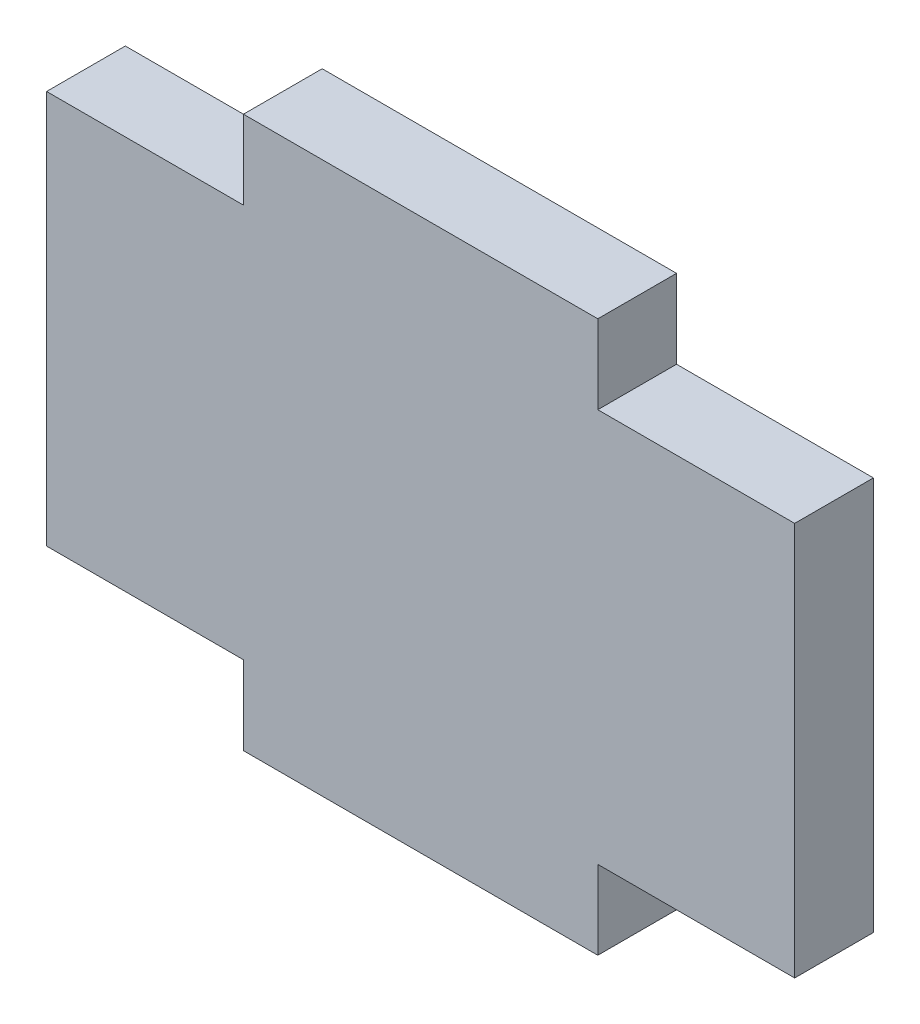
ISO-10303-21;
HEADER;
FILE_DESCRIPTION(('STEP AP214'),'2;1');
FILE_NAME('part.step','',(''),(''),'','','');
FILE_SCHEMA(('AUTOMOTIVE_DESIGN { 1 0 10303 214 1 1 1 1 }'));
ENDSEC;
DATA;
#1=APPLICATION_CONTEXT('core data for automotive mechanical design processes');
#2=APPLICATION_PROTOCOL_DEFINITION('international standard','automotive_design',2000,#1);
#3=PRODUCT_CONTEXT('',#1,'mechanical');
#4=PRODUCT('Part','Part','',(#3));
#5=PRODUCT_RELATED_PRODUCT_CATEGORY('part','',(#4));
#6=PRODUCT_DEFINITION_FORMATION('','',#4);
#7=PRODUCT_DEFINITION_CONTEXT('part definition',#1,'design');
#8=PRODUCT_DEFINITION('design','',#6,#7);
#9=PRODUCT_DEFINITION_SHAPE('','',#8);
#10=(LENGTH_UNIT() NAMED_UNIT(*) SI_UNIT(.MILLI.,.METRE.));
#11=(NAMED_UNIT(*) PLANE_ANGLE_UNIT() SI_UNIT($,.RADIAN.));
#12=(NAMED_UNIT(*) SI_UNIT($,.STERADIAN.) SOLID_ANGLE_UNIT());
#13=UNCERTAINTY_MEASURE_WITH_UNIT(LENGTH_MEASURE(1.E-05),#10,'distance_accuracy_value','');
#14=(GEOMETRIC_REPRESENTATION_CONTEXT(3) GLOBAL_UNCERTAINTY_ASSIGNED_CONTEXT((#13)) GLOBAL_UNIT_ASSIGNED_CONTEXT((#10,
#11,#12)) REPRESENTATION_CONTEXT('',''));
#15=CARTESIAN_POINT('',(0.,0.,0.));
#16=DIRECTION('',(0.,0.,1.));
#17=DIRECTION('',(1.,0.,0.));
#18=AXIS2_PLACEMENT_3D('',#15,#16,#17);
#19=CARTESIAN_POINT('',(19.,20.,4.));
#20=DIRECTION('',(-1.,0.,0.));
#21=DIRECTION('',(0.,-1.,0.));
#22=AXIS2_PLACEMENT_3D('',#19,#20,#21);
#23=PLANE('',#22);
#24=DIRECTION('',(0.,1.,0.));
#25=VECTOR('',#24,1.);
#26=CARTESIAN_POINT('',(19.,20.,0.));
#27=LINE('',#26,#25);
#28=CARTESIAN_POINT('',(19.,0.,0.));
#29=VERTEX_POINT('',#28);
#30=CARTESIAN_POINT('',(19.,20.,0.));
#31=VERTEX_POINT('',#30);
#32=EDGE_CURVE('E153',#29,#31,#27,.T.);
#33=ORIENTED_EDGE('',*,*,#32,.T.);
#34=DIRECTION('',(0.,0.,-1.));
#35=VECTOR('',#34,1.);
#36=CARTESIAN_POINT('',(19.,20.,4.));
#37=LINE('',#36,#35);
#38=CARTESIAN_POINT('',(19.,20.,4.));
#39=VERTEX_POINT('',#38);
#40=EDGE_CURVE('E11',#39,#31,#37,.T.);
#41=ORIENTED_EDGE('',*,*,#40,.F.);
#42=DIRECTION('',(0.,1.,0.));
#43=VECTOR('',#42,1.);
#44=CARTESIAN_POINT('',(19.,20.,4.));
#45=LINE('',#44,#43);
#46=CARTESIAN_POINT('',(19.,0.,4.));
#47=VERTEX_POINT('',#46);
#48=EDGE_CURVE('E175',#47,#39,#45,.T.);
#49=ORIENTED_EDGE('',*,*,#48,.F.);
#50=DIRECTION('',(0.,0.,-1.));
#51=VECTOR('',#50,1.);
#52=CARTESIAN_POINT('',(19.,0.,4.));
#53=LINE('',#52,#51);
#54=EDGE_CURVE('E149',#47,#29,#53,.T.);
#55=ORIENTED_EDGE('',*,*,#54,.T.);
#56=EDGE_LOOP('',(#33,#41,#49,#55));
#57=FACE_BOUND('',#56,.T.);
#58=ADVANCED_FACE('F33',(#57),#23,.F.);
#59=CARTESIAN_POINT('',(9.,20.,4.));
#60=DIRECTION('',(0.,-1.,0.));
#61=DIRECTION('',(0.,0.,-1.));
#62=AXIS2_PLACEMENT_3D('',#59,#60,#61);
#63=PLANE('',#62);
#64=DIRECTION('',(-1.,0.,0.));
#65=VECTOR('',#64,1.);
#66=CARTESIAN_POINT('',(9.,20.,0.));
#67=LINE('',#66,#65);
#68=CARTESIAN_POINT('',(9.,20.,0.));
#69=VERTEX_POINT('',#68);
#70=EDGE_CURVE('E156',#31,#69,#67,.T.);
#71=ORIENTED_EDGE('',*,*,#70,.T.);
#72=DIRECTION('',(0.,0.,-1.));
#73=VECTOR('',#72,1.);
#74=CARTESIAN_POINT('',(9.,20.,4.));
#75=LINE('',#74,#73);
#76=CARTESIAN_POINT('',(9.,20.,4.));
#77=VERTEX_POINT('',#76);
#78=EDGE_CURVE('E41',#77,#69,#75,.T.);
#79=ORIENTED_EDGE('',*,*,#78,.F.);
#80=DIRECTION('',(-1.,0.,0.));
#81=VECTOR('',#80,1.);
#82=CARTESIAN_POINT('',(9.,20.,4.));
#83=LINE('',#82,#81);
#84=EDGE_CURVE('E104',#39,#77,#83,.T.);
#85=ORIENTED_EDGE('',*,*,#84,.F.);
#86=ORIENTED_EDGE('',*,*,#40,.T.);
#87=EDGE_LOOP('',(#71,#79,#85,#86));
#88=FACE_BOUND('',#87,.T.);
#89=ADVANCED_FACE('F253',(#88),#63,.F.);
#90=CARTESIAN_POINT('',(9.,20.,4.));
#91=DIRECTION('',(-1.,0.,0.));
#92=DIRECTION('',(0.,0.,1.));
#93=AXIS2_PLACEMENT_3D('',#90,#91,#92);
#94=PLANE('',#93);
#95=DIRECTION('',(0.,1.,0.));
#96=VECTOR('',#95,1.);
#97=CARTESIAN_POINT('',(9.,20.,0.));
#98=LINE('',#97,#96);
#99=CARTESIAN_POINT('',(9.,24.,0.));
#100=VERTEX_POINT('',#99);
#101=EDGE_CURVE('E158',#69,#100,#98,.T.);
#102=ORIENTED_EDGE('',*,*,#101,.T.);
#103=DIRECTION('',(0.,0.,-1.));
#104=VECTOR('',#103,1.);
#105=CARTESIAN_POINT('',(9.,24.,4.));
#106=LINE('',#105,#104);
#107=CARTESIAN_POINT('',(9.,24.,4.));
#108=VERTEX_POINT('',#107);
#109=EDGE_CURVE('E194',#108,#100,#106,.T.);
#110=ORIENTED_EDGE('',*,*,#109,.F.);
#111=DIRECTION('',(0.,1.,0.));
#112=VECTOR('',#111,1.);
#113=CARTESIAN_POINT('',(9.,20.,4.));
#114=LINE('',#113,#112);
#115=EDGE_CURVE('E202',#77,#108,#114,.T.);
#116=ORIENTED_EDGE('',*,*,#115,.F.);
#117=ORIENTED_EDGE('',*,*,#78,.T.);
#118=EDGE_LOOP('',(#102,#110,#116,#117));
#119=FACE_BOUND('',#118,.T.);
#120=ADVANCED_FACE('F200',(#119),#94,.F.);
#121=CARTESIAN_POINT('',(-9.,24.,4.));
#122=DIRECTION('',(0.,-1.,0.));
#123=DIRECTION('',(0.,0.,-1.));
#124=AXIS2_PLACEMENT_3D('',#121,#122,#123);
#125=PLANE('',#124);
#126=DIRECTION('',(-1.,0.,0.));
#127=VECTOR('',#126,1.);
#128=CARTESIAN_POINT('',(-9.,24.,0.));
#129=LINE('',#128,#127);
#130=CARTESIAN_POINT('',(-9.,24.,0.));
#131=VERTEX_POINT('',#130);
#132=EDGE_CURVE('E160',#100,#131,#129,.T.);
#133=ORIENTED_EDGE('',*,*,#132,.T.);
#134=DIRECTION('',(0.,0.,-1.));
#135=VECTOR('',#134,1.);
#136=CARTESIAN_POINT('',(-9.,24.,4.));
#137=LINE('',#136,#135);
#138=CARTESIAN_POINT('',(-9.,24.,4.));
#139=VERTEX_POINT('',#138);
#140=EDGE_CURVE('E191',#139,#131,#137,.T.);
#141=ORIENTED_EDGE('',*,*,#140,.F.);
#142=DIRECTION('',(-1.,0.,0.));
#143=VECTOR('',#142,1.);
#144=CARTESIAN_POINT('',(-9.,24.,4.));
#145=LINE('',#144,#143);
#146=EDGE_CURVE('E220',#108,#139,#145,.T.);
#147=ORIENTED_EDGE('',*,*,#146,.F.);
#148=ORIENTED_EDGE('',*,*,#109,.T.);
#149=EDGE_LOOP('',(#133,#141,#147,#148));
#150=FACE_BOUND('',#149,.T.);
#151=ADVANCED_FACE('F211',(#150),#125,.F.);
#152=CARTESIAN_POINT('',(-9.,20.,4.));
#153=DIRECTION('',(1.,0.,0.));
#154=DIRECTION('',(0.,0.,-1.));
#155=AXIS2_PLACEMENT_3D('',#152,#153,#154);
#156=PLANE('',#155);
#157=DIRECTION('',(0.,-1.,0.));
#158=VECTOR('',#157,1.);
#159=CARTESIAN_POINT('',(-9.,20.,0.));
#160=LINE('',#159,#158);
#161=CARTESIAN_POINT('',(-9.,20.,0.));
#162=VERTEX_POINT('',#161);
#163=EDGE_CURVE('E162',#131,#162,#160,.T.);
#164=ORIENTED_EDGE('',*,*,#163,.T.);
#165=DIRECTION('',(0.,0.,-1.));
#166=VECTOR('',#165,1.);
#167=CARTESIAN_POINT('',(-9.,20.,4.));
#168=LINE('',#167,#166);
#169=CARTESIAN_POINT('',(-9.,20.,4.));
#170=VERTEX_POINT('',#169);
#171=EDGE_CURVE('E188',#170,#162,#168,.T.);
#172=ORIENTED_EDGE('',*,*,#171,.F.);
#173=DIRECTION('',(0.,-1.,0.));
#174=VECTOR('',#173,1.);
#175=CARTESIAN_POINT('',(-9.,20.,4.));
#176=LINE('',#175,#174);
#177=EDGE_CURVE('E217',#139,#170,#176,.T.);
#178=ORIENTED_EDGE('',*,*,#177,.F.);
#179=ORIENTED_EDGE('',*,*,#140,.T.);
#180=EDGE_LOOP('',(#164,#172,#178,#179));
#181=FACE_BOUND('',#180,.T.);
#182=ADVANCED_FACE('F215',(#181),#156,.F.);
#183=CARTESIAN_POINT('',(-19.,20.,4.));
#184=DIRECTION('',(0.,-1.,0.));
#185=DIRECTION('',(0.,0.,-1.));
#186=AXIS2_PLACEMENT_3D('',#183,#184,#185);
#187=PLANE('',#186);
#188=DIRECTION('',(-1.,0.,0.));
#189=VECTOR('',#188,1.);
#190=CARTESIAN_POINT('',(-19.,20.,0.));
#191=LINE('',#190,#189);
#192=CARTESIAN_POINT('',(-19.,20.,0.));
#193=VERTEX_POINT('',#192);
#194=EDGE_CURVE('E164',#162,#193,#191,.T.);
#195=ORIENTED_EDGE('',*,*,#194,.T.);
#196=DIRECTION('',(0.,0.,-1.));
#197=VECTOR('',#196,1.);
#198=CARTESIAN_POINT('',(-19.,20.,4.));
#199=LINE('',#198,#197);
#200=CARTESIAN_POINT('',(-19.,20.,4.));
#201=VERTEX_POINT('',#200);
#202=EDGE_CURVE('E185',#201,#193,#199,.T.);
#203=ORIENTED_EDGE('',*,*,#202,.F.);
#204=DIRECTION('',(-1.,0.,0.));
#205=VECTOR('',#204,1.);
#206=CARTESIAN_POINT('',(-19.,20.,4.));
#207=LINE('',#206,#205);
#208=EDGE_CURVE('E219',#170,#201,#207,.T.);
#209=ORIENTED_EDGE('',*,*,#208,.F.);
#210=ORIENTED_EDGE('',*,*,#171,.T.);
#211=EDGE_LOOP('',(#195,#203,#209,#210));
#212=FACE_BOUND('',#211,.T.);
#213=ADVANCED_FACE('F266',(#212),#187,.F.);
#214=CARTESIAN_POINT('',(-19.,20.,4.));
#215=DIRECTION('',(1.,0.,0.));
#216=DIRECTION('',(0.,1.,0.));
#217=AXIS2_PLACEMENT_3D('',#214,#215,#216);
#218=PLANE('',#217);
#219=DIRECTION('',(0.,-1.,0.));
#220=VECTOR('',#219,1.);
#221=CARTESIAN_POINT('',(-19.,20.,0.));
#222=LINE('',#221,#220);
#223=CARTESIAN_POINT('',(-19.,0.,0.));
#224=VERTEX_POINT('',#223);
#225=EDGE_CURVE('E166',#193,#224,#222,.T.);
#226=ORIENTED_EDGE('',*,*,#225,.T.);
#227=DIRECTION('',(0.,0.,-1.));
#228=VECTOR('',#227,1.);
#229=CARTESIAN_POINT('',(-19.,0.,4.));
#230=LINE('',#229,#228);
#231=CARTESIAN_POINT('',(-19.,0.,4.));
#232=VERTEX_POINT('',#231);
#233=EDGE_CURVE('E182',#232,#224,#230,.T.);
#234=ORIENTED_EDGE('',*,*,#233,.F.);
#235=DIRECTION('',(0.,-1.,0.));
#236=VECTOR('',#235,1.);
#237=CARTESIAN_POINT('',(-19.,20.,4.));
#238=LINE('',#237,#236);
#239=EDGE_CURVE('E222',#201,#232,#238,.T.);
#240=ORIENTED_EDGE('',*,*,#239,.F.);
#241=ORIENTED_EDGE('',*,*,#202,.T.);
#242=EDGE_LOOP('',(#226,#234,#240,#241));
#243=FACE_BOUND('',#242,.T.);
#244=ADVANCED_FACE('F269',(#243),#218,.F.);
#245=CARTESIAN_POINT('',(-19.,0.,4.));
#246=DIRECTION('',(0.,1.,0.));
#247=DIRECTION('',(-1.,0.,0.));
#248=AXIS2_PLACEMENT_3D('',#245,#246,#247);
#249=PLANE('',#248);
#250=DIRECTION('',(1.,0.,0.));
#251=VECTOR('',#250,1.);
#252=CARTESIAN_POINT('',(-19.,0.,0.));
#253=LINE('',#252,#251);
#254=CARTESIAN_POINT('',(-8.99999999999999,0.,0.));
#255=VERTEX_POINT('',#254);
#256=EDGE_CURVE('E168',#224,#255,#253,.T.);
#257=ORIENTED_EDGE('',*,*,#256,.T.);
#258=DIRECTION('',(0.,0.,-1.));
#259=VECTOR('',#258,1.);
#260=CARTESIAN_POINT('',(-8.99999999999999,0.,4.));
#261=LINE('',#260,#259);
#262=CARTESIAN_POINT('',(-8.99999999999999,0.,4.));
#263=VERTEX_POINT('',#262);
#264=EDGE_CURVE('E179',#263,#255,#261,.T.);
#265=ORIENTED_EDGE('',*,*,#264,.F.);
#266=DIRECTION('',(1.,0.,0.));
#267=VECTOR('',#266,1.);
#268=CARTESIAN_POINT('',(-19.,0.,4.));
#269=LINE('',#268,#267);
#270=EDGE_CURVE('E228',#232,#263,#269,.T.);
#271=ORIENTED_EDGE('',*,*,#270,.F.);
#272=ORIENTED_EDGE('',*,*,#233,.T.);
#273=EDGE_LOOP('',(#257,#265,#271,#272));
#274=FACE_BOUND('',#273,.T.);
#275=ADVANCED_FACE('F234',(#274),#249,.F.);
#276=CARTESIAN_POINT('',(-8.99999999999999,0.,4.));
#277=DIRECTION('',(1.,0.,0.));
#278=DIRECTION('',(0.,0.,-1.));
#279=AXIS2_PLACEMENT_3D('',#276,#277,#278);
#280=PLANE('',#279);
#281=DIRECTION('',(0.,-1.,0.));
#282=VECTOR('',#281,1.);
#283=CARTESIAN_POINT('',(-8.99999999999999,0.,0.));
#284=LINE('',#283,#282);
#285=CARTESIAN_POINT('',(-8.99999999999999,-4.,0.));
#286=VERTEX_POINT('',#285);
#287=EDGE_CURVE('E170',#255,#286,#284,.T.);
#288=ORIENTED_EDGE('',*,*,#287,.T.);
#289=DIRECTION('',(0.,0.,-1.));
#290=VECTOR('',#289,1.);
#291=CARTESIAN_POINT('',(-8.99999999999999,-4.,4.));
#292=LINE('',#291,#290);
#293=CARTESIAN_POINT('',(-8.99999999999999,-4.,4.));
#294=VERTEX_POINT('',#293);
#295=EDGE_CURVE('E144',#294,#286,#292,.T.);
#296=ORIENTED_EDGE('',*,*,#295,.F.);
#297=DIRECTION('',(0.,-1.,0.));
#298=VECTOR('',#297,1.);
#299=CARTESIAN_POINT('',(-8.99999999999999,0.,4.));
#300=LINE('',#299,#298);
#301=EDGE_CURVE('E135',#263,#294,#300,.T.);
#302=ORIENTED_EDGE('',*,*,#301,.F.);
#303=ORIENTED_EDGE('',*,*,#264,.T.);
#304=EDGE_LOOP('',(#288,#296,#302,#303));
#305=FACE_BOUND('',#304,.T.);
#306=ADVANCED_FACE('F238',(#305),#280,.F.);
#307=CARTESIAN_POINT('',(-8.99999999999999,-4.,4.));
#308=DIRECTION('',(0.,1.,0.));
#309=DIRECTION('',(0.,0.,1.));
#310=AXIS2_PLACEMENT_3D('',#307,#308,#309);
#311=PLANE('',#310);
#312=DIRECTION('',(1.,0.,0.));
#313=VECTOR('',#312,1.);
#314=CARTESIAN_POINT('',(-8.99999999999999,-4.,0.));
#315=LINE('',#314,#313);
#316=CARTESIAN_POINT('',(9.00000000000001,-4.,0.));
#317=VERTEX_POINT('',#316);
#318=EDGE_CURVE('E143',#286,#317,#315,.T.);
#319=ORIENTED_EDGE('',*,*,#318,.T.);
#320=DIRECTION('',(0.,0.,-1.));
#321=VECTOR('',#320,1.);
#322=CARTESIAN_POINT('',(9.00000000000001,-4.,4.));
#323=LINE('',#322,#321);
#324=CARTESIAN_POINT('',(9.00000000000001,-4.,4.));
#325=VERTEX_POINT('',#324);
#326=EDGE_CURVE('E140',#325,#317,#323,.T.);
#327=ORIENTED_EDGE('',*,*,#326,.F.);
#328=DIRECTION('',(1.,0.,0.));
#329=VECTOR('',#328,1.);
#330=CARTESIAN_POINT('',(-8.99999999999999,-4.,4.));
#331=LINE('',#330,#329);
#332=EDGE_CURVE('E129',#294,#325,#331,.T.);
#333=ORIENTED_EDGE('',*,*,#332,.F.);
#334=ORIENTED_EDGE('',*,*,#295,.T.);
#335=EDGE_LOOP('',(#319,#327,#333,#334));
#336=FACE_BOUND('',#335,.T.);
#337=ADVANCED_FACE('F141',(#336),#311,.F.);
#338=CARTESIAN_POINT('',(9.,0.,4.));
#339=DIRECTION('',(-1.,0.,0.));
#340=DIRECTION('',(0.,-1.,0.));
#341=AXIS2_PLACEMENT_3D('',#338,#339,#340);
#342=PLANE('',#341);
#343=DIRECTION('',(0.,1.,0.));
#344=VECTOR('',#343,1.);
#345=CARTESIAN_POINT('',(9.,0.,0.));
#346=LINE('',#345,#344);
#347=CARTESIAN_POINT('',(9.,0.,0.));
#348=VERTEX_POINT('',#347);
#349=EDGE_CURVE('E90',#317,#348,#346,.T.);
#350=ORIENTED_EDGE('',*,*,#349,.T.);
#351=DIRECTION('',(0.,0.,-1.));
#352=VECTOR('',#351,1.);
#353=CARTESIAN_POINT('',(9.,0.,4.));
#354=LINE('',#353,#352);
#355=CARTESIAN_POINT('',(9.,0.,4.));
#356=VERTEX_POINT('',#355);
#357=EDGE_CURVE('E145',#356,#348,#354,.T.);
#358=ORIENTED_EDGE('',*,*,#357,.F.);
#359=DIRECTION('',(0.,1.,0.));
#360=VECTOR('',#359,1.);
#361=CARTESIAN_POINT('',(9.,0.,4.));
#362=LINE('',#361,#360);
#363=EDGE_CURVE('E133',#325,#356,#362,.T.);
#364=ORIENTED_EDGE('',*,*,#363,.F.);
#365=ORIENTED_EDGE('',*,*,#326,.T.);
#366=EDGE_LOOP('',(#350,#358,#364,#365));
#367=FACE_BOUND('',#366,.T.);
#368=ADVANCED_FACE('F147',(#367),#342,.F.);
#369=CARTESIAN_POINT('',(9.,0.,4.));
#370=DIRECTION('',(0.,1.,0.));
#371=DIRECTION('',(-1.,0.,0.));
#372=AXIS2_PLACEMENT_3D('',#369,#370,#371);
#373=PLANE('',#372);
#374=DIRECTION('',(1.,0.,0.));
#375=VECTOR('',#374,1.);
#376=CARTESIAN_POINT('',(9.,0.,0.));
#377=LINE('',#376,#375);
#378=EDGE_CURVE('E96',#348,#29,#377,.T.);
#379=ORIENTED_EDGE('',*,*,#378,.T.);
#380=ORIENTED_EDGE('',*,*,#54,.F.);
#381=DIRECTION('',(1.,0.,0.));
#382=VECTOR('',#381,1.);
#383=CARTESIAN_POINT('',(9.,0.,4.));
#384=LINE('',#383,#382);
#385=EDGE_CURVE('E49',#356,#47,#384,.T.);
#386=ORIENTED_EDGE('',*,*,#385,.F.);
#387=ORIENTED_EDGE('',*,*,#357,.T.);
#388=EDGE_LOOP('',(#379,#380,#386,#387));
#389=FACE_BOUND('',#388,.T.);
#390=ADVANCED_FACE('F242',(#389),#373,.F.);
#391=CARTESIAN_POINT('',(0.,0.,4.));
#392=DIRECTION('',(0.,0.,1.));
#393=DIRECTION('',(1.,0.,0.));
#394=AXIS2_PLACEMENT_3D('',#391,#392,#393);
#395=PLANE('',#394);
#396=ORIENTED_EDGE('',*,*,#48,.T.);
#397=ORIENTED_EDGE('',*,*,#84,.T.);
#398=ORIENTED_EDGE('',*,*,#115,.T.);
#399=ORIENTED_EDGE('',*,*,#146,.T.);
#400=ORIENTED_EDGE('',*,*,#177,.T.);
#401=ORIENTED_EDGE('',*,*,#208,.T.);
#402=ORIENTED_EDGE('',*,*,#239,.T.);
#403=ORIENTED_EDGE('',*,*,#270,.T.);
#404=ORIENTED_EDGE('',*,*,#301,.T.);
#405=ORIENTED_EDGE('',*,*,#332,.T.);
#406=ORIENTED_EDGE('',*,*,#363,.T.);
#407=ORIENTED_EDGE('',*,*,#385,.T.);
#408=EDGE_LOOP('',(#396,#397,#398,#399,#400,#401,#402,#403,#404,#405,#406,#407));
#409=FACE_BOUND('',#408,.T.);
#410=ADVANCED_FACE('F131',(#409),#395,.T.);
#411=CARTESIAN_POINT('',(0.,0.,0.));
#412=DIRECTION('',(0.,0.,1.));
#413=DIRECTION('',(1.,0.,0.));
#414=AXIS2_PLACEMENT_3D('',#411,#412,#413);
#415=PLANE('',#414);
#416=ORIENTED_EDGE('',*,*,#32,.F.);
#417=ORIENTED_EDGE('',*,*,#378,.F.);
#418=ORIENTED_EDGE('',*,*,#349,.F.);
#419=ORIENTED_EDGE('',*,*,#318,.F.);
#420=ORIENTED_EDGE('',*,*,#287,.F.);
#421=ORIENTED_EDGE('',*,*,#256,.F.);
#422=ORIENTED_EDGE('',*,*,#225,.F.);
#423=ORIENTED_EDGE('',*,*,#194,.F.);
#424=ORIENTED_EDGE('',*,*,#163,.F.);
#425=ORIENTED_EDGE('',*,*,#132,.F.);
#426=ORIENTED_EDGE('',*,*,#101,.F.);
#427=ORIENTED_EDGE('',*,*,#70,.F.);
#428=EDGE_LOOP('',(#416,#417,#418,#419,#420,#421,#422,#423,#424,#425,#426,#427));
#429=FACE_BOUND('',#428,.T.);
#430=ADVANCED_FACE('F206',(#429),#415,.F.);
#431=CLOSED_SHELL('',(#58,#89,#120,#151,#182,#213,#244,#275,#306,#337,#368,#390,#410,#430));
#432=MANIFOLD_SOLID_BREP('B2',#431);
#433=ADVANCED_BREP_SHAPE_REPRESENTATION('',(#18,#432),#14);
#434=SHAPE_DEFINITION_REPRESENTATION(#9,#433);
ENDSEC;
END-ISO-10303-21;
